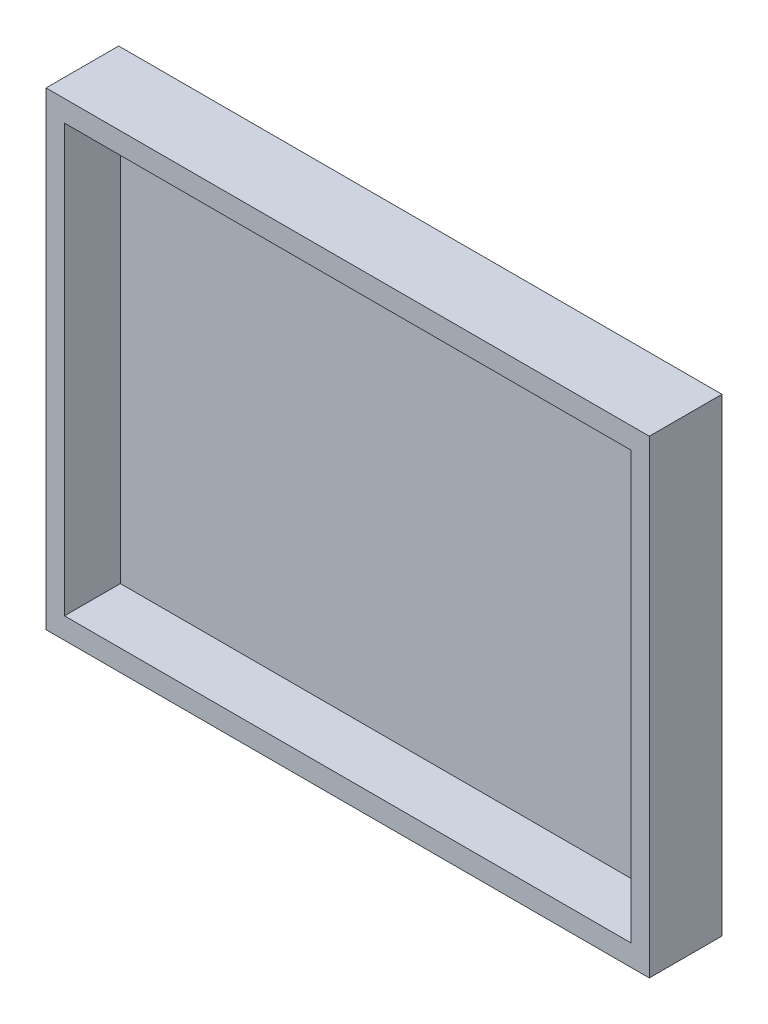
ISO-10303-21;
HEADER;
FILE_DESCRIPTION(('STEP AP214'),'2;1');
FILE_NAME('part.step','',(''),(''),'','','');
FILE_SCHEMA(('AUTOMOTIVE_DESIGN { 1 0 10303 214 1 1 1 1 }'));
ENDSEC;
DATA;
#1=APPLICATION_CONTEXT('core data for automotive mechanical design processes');
#2=APPLICATION_PROTOCOL_DEFINITION('international standard','automotive_design',2000,#1);
#3=PRODUCT_CONTEXT('',#1,'mechanical');
#4=PRODUCT('Part','Part','',(#3));
#5=PRODUCT_RELATED_PRODUCT_CATEGORY('part','',(#4));
#6=PRODUCT_DEFINITION_FORMATION('','',#4);
#7=PRODUCT_DEFINITION_CONTEXT('part definition',#1,'design');
#8=PRODUCT_DEFINITION('design','',#6,#7);
#9=PRODUCT_DEFINITION_SHAPE('','',#8);
#10=(LENGTH_UNIT() NAMED_UNIT(*) SI_UNIT(.MILLI.,.METRE.));
#11=(NAMED_UNIT(*) PLANE_ANGLE_UNIT() SI_UNIT($,.RADIAN.));
#12=(NAMED_UNIT(*) SI_UNIT($,.STERADIAN.) SOLID_ANGLE_UNIT());
#13=UNCERTAINTY_MEASURE_WITH_UNIT(LENGTH_MEASURE(1.E-05),#10,'distance_accuracy_value','');
#14=(GEOMETRIC_REPRESENTATION_CONTEXT(3) GLOBAL_UNCERTAINTY_ASSIGNED_CONTEXT((#13)) GLOBAL_UNIT_ASSIGNED_CONTEXT((#10,
#11,#12)) REPRESENTATION_CONTEXT('',''));
#15=CARTESIAN_POINT('',(0.,0.,0.));
#16=DIRECTION('',(0.,0.,1.));
#17=DIRECTION('',(1.,0.,0.));
#18=AXIS2_PLACEMENT_3D('',#15,#16,#17);
#19=CARTESIAN_POINT('',(0.,0.,0.));
#20=DIRECTION('',(0.,0.,1.));
#21=DIRECTION('',(1.,0.,0.));
#22=AXIS2_PLACEMENT_3D('',#19,#20,#21);
#23=PLANE('',#22);
#24=CARTESIAN_POINT('',(0.,0.,0.));
#25=DIRECTION('',(0.,0.,1.));
#26=DIRECTION('',(1.,0.,0.));
#27=AXIS2_PLACEMENT_3D('',#24,#25,#26);
#28=CIRCLE('',#27,7.5);
#29=CARTESIAN_POINT('',(7.5,0.,0.));
#30=VERTEX_POINT('',#29);
#31=EDGE_CURVE('E47',#30,#30,#28,.T.);
#32=ORIENTED_EDGE('',*,*,#31,.F.);
#33=EDGE_LOOP('',(#32));
#34=FACE_BOUND('',#33,.T.);
#35=CARTESIAN_POINT('',(0.,0.,0.));
#36=DIRECTION('',(0.,0.,1.));
#37=DIRECTION('',(1.,0.,0.));
#38=AXIS2_PLACEMENT_3D('',#35,#36,#37);
#39=CIRCLE('',#38,4.5);
#40=CARTESIAN_POINT('',(4.5,0.,0.));
#41=VERTEX_POINT('',#40);
#42=EDGE_CURVE('E208',#41,#41,#39,.T.);
#43=ORIENTED_EDGE('',*,*,#42,.T.);
#44=EDGE_LOOP('',(#43));
#45=FACE_BOUND('',#44,.T.);
#46=ADVANCED_FACE('F43',(#34,#45),#23,.F.);
#47=CARTESIAN_POINT('',(0.,0.,10.));
#48=DIRECTION('',(0.,0.,-1.));
#49=DIRECTION('',(-1.,0.,0.));
#50=AXIS2_PLACEMENT_3D('',#47,#48,#49);
#51=CYLINDRICAL_SURFACE('',#50,7.5);
#52=CARTESIAN_POINT('',(0.,0.,10.));
#53=DIRECTION('',(0.,0.,1.));
#54=DIRECTION('',(1.,0.,0.));
#55=AXIS2_PLACEMENT_3D('',#52,#53,#54);
#56=CIRCLE('',#55,7.5);
#57=CARTESIAN_POINT('',(7.5,0.,10.));
#58=VERTEX_POINT('',#57);
#59=EDGE_CURVE('E11',#58,#58,#56,.T.);
#60=ORIENTED_EDGE('',*,*,#59,.F.);
#61=EDGE_LOOP('',(#60));
#62=FACE_BOUND('',#61,.T.);
#63=ORIENTED_EDGE('',*,*,#31,.T.);
#64=EDGE_LOOP('',(#63));
#65=FACE_BOUND('',#64,.T.);
#66=ADVANCED_FACE('F45',(#62,#65),#51,.T.);
#67=CARTESIAN_POINT('',(0.,0.,10.));
#68=DIRECTION('',(0.,0.,-1.));
#69=DIRECTION('',(-1.,0.,0.));
#70=AXIS2_PLACEMENT_3D('',#67,#68,#69);
#71=CYLINDRICAL_SURFACE('',#70,4.5);
#72=CARTESIAN_POINT('',(0.,0.,10.));
#73=DIRECTION('',(0.,0.,1.));
#74=DIRECTION('',(1.,0.,0.));
#75=AXIS2_PLACEMENT_3D('',#72,#73,#74);
#76=CIRCLE('',#75,4.5);
#77=CARTESIAN_POINT('',(4.5,0.,10.));
#78=VERTEX_POINT('',#77);
#79=EDGE_CURVE('E204',#78,#78,#76,.T.);
#80=ORIENTED_EDGE('',*,*,#79,.T.);
#81=EDGE_LOOP('',(#80));
#82=FACE_BOUND('',#81,.T.);
#83=ORIENTED_EDGE('',*,*,#42,.F.);
#84=EDGE_LOOP('',(#83));
#85=FACE_BOUND('',#84,.T.);
#86=ADVANCED_FACE('F222',(#82,#85),#71,.F.);
#87=CARTESIAN_POINT('',(0.,0.,10.));
#88=DIRECTION('',(0.,0.,-1.));
#89=DIRECTION('',(-1.,0.,0.));
#90=AXIS2_PLACEMENT_3D('',#87,#88,#89);
#91=PLANE('',#90);
#92=ORIENTED_EDGE('',*,*,#79,.F.);
#93=EDGE_LOOP('',(#92));
#94=FACE_BOUND('',#93,.T.);
#95=ADVANCED_FACE('F227',(#94),#91,.T.);
#96=CARTESIAN_POINT('',(27.,-21.,16.5));
#97=DIRECTION('',(-1.,0.,0.));
#98=DIRECTION('',(0.,-1.,0.));
#99=AXIS2_PLACEMENT_3D('',#96,#97,#98);
#100=PLANE('',#99);
#101=DIRECTION('',(0.,1.,0.));
#102=VECTOR('',#101,1.);
#103=CARTESIAN_POINT('',(27.,-21.,10.));
#104=LINE('',#103,#102);
#105=CARTESIAN_POINT('',(27.,-21.,10.));
#106=VERTEX_POINT('',#105);
#107=CARTESIAN_POINT('',(27.,21.,10.));
#108=VERTEX_POINT('',#107);
#109=EDGE_CURVE('E164',#106,#108,#104,.T.);
#110=ORIENTED_EDGE('',*,*,#109,.T.);
#111=DIRECTION('',(0.,0.,-1.));
#112=VECTOR('',#111,1.);
#113=CARTESIAN_POINT('',(27.,21.,16.5));
#114=LINE('',#113,#112);
#115=CARTESIAN_POINT('',(27.,21.,16.5));
#116=VERTEX_POINT('',#115);
#117=EDGE_CURVE('E201',#116,#108,#114,.T.);
#118=ORIENTED_EDGE('',*,*,#117,.F.);
#119=DIRECTION('',(0.,1.,0.));
#120=VECTOR('',#119,1.);
#121=CARTESIAN_POINT('',(27.,-21.,16.5));
#122=LINE('',#121,#120);
#123=CARTESIAN_POINT('',(27.,-21.,16.5));
#124=VERTEX_POINT('',#123);
#125=EDGE_CURVE('E170',#124,#116,#122,.T.);
#126=ORIENTED_EDGE('',*,*,#125,.F.);
#127=DIRECTION('',(0.,0.,-1.));
#128=VECTOR('',#127,1.);
#129=CARTESIAN_POINT('',(27.,-21.,16.5));
#130=LINE('',#129,#128);
#131=EDGE_CURVE('E180',#124,#106,#130,.T.);
#132=ORIENTED_EDGE('',*,*,#131,.T.);
#133=EDGE_LOOP('',(#110,#118,#126,#132));
#134=FACE_BOUND('',#133,.T.);
#135=ADVANCED_FACE('F229',(#134),#100,.F.);
#136=CARTESIAN_POINT('',(-27.,21.,16.5));
#137=DIRECTION('',(0.,-1.,0.));
#138=DIRECTION('',(0.,0.,-1.));
#139=AXIS2_PLACEMENT_3D('',#136,#137,#138);
#140=PLANE('',#139);
#141=DIRECTION('',(-1.,0.,0.));
#142=VECTOR('',#141,1.);
#143=CARTESIAN_POINT('',(-27.,21.,10.));
#144=LINE('',#143,#142);
#145=CARTESIAN_POINT('',(-27.,21.,10.));
#146=VERTEX_POINT('',#145);
#147=EDGE_CURVE('E184',#108,#146,#144,.T.);
#148=ORIENTED_EDGE('',*,*,#147,.T.);
#149=DIRECTION('',(0.,0.,-1.));
#150=VECTOR('',#149,1.);
#151=CARTESIAN_POINT('',(-27.,21.,16.5));
#152=LINE('',#151,#150);
#153=CARTESIAN_POINT('',(-27.,21.,16.5));
#154=VERTEX_POINT('',#153);
#155=EDGE_CURVE('E197',#154,#146,#152,.T.);
#156=ORIENTED_EDGE('',*,*,#155,.F.);
#157=DIRECTION('',(-1.,0.,0.));
#158=VECTOR('',#157,1.);
#159=CARTESIAN_POINT('',(-27.,21.,16.5));
#160=LINE('',#159,#158);
#161=EDGE_CURVE('E97',#116,#154,#160,.T.);
#162=ORIENTED_EDGE('',*,*,#161,.F.);
#163=ORIENTED_EDGE('',*,*,#117,.T.);
#164=EDGE_LOOP('',(#148,#156,#162,#163));
#165=FACE_BOUND('',#164,.T.);
#166=ADVANCED_FACE('F232',(#165),#140,.F.);
#167=CARTESIAN_POINT('',(-27.,-21.,16.5));
#168=DIRECTION('',(1.,0.,0.));
#169=DIRECTION('',(0.,0.,-1.));
#170=AXIS2_PLACEMENT_3D('',#167,#168,#169);
#171=PLANE('',#170);
#172=DIRECTION('',(0.,-1.,0.));
#173=VECTOR('',#172,1.);
#174=CARTESIAN_POINT('',(-27.,-21.,10.));
#175=LINE('',#174,#173);
#176=CARTESIAN_POINT('',(-27.,-21.,10.));
#177=VERTEX_POINT('',#176);
#178=EDGE_CURVE('E187',#146,#177,#175,.T.);
#179=ORIENTED_EDGE('',*,*,#178,.T.);
#180=DIRECTION('',(0.,0.,-1.));
#181=VECTOR('',#180,1.);
#182=CARTESIAN_POINT('',(-27.,-21.,16.5));
#183=LINE('',#182,#181);
#184=CARTESIAN_POINT('',(-27.,-21.,16.5));
#185=VERTEX_POINT('',#184);
#186=EDGE_CURVE('E194',#185,#177,#183,.T.);
#187=ORIENTED_EDGE('',*,*,#186,.F.);
#188=DIRECTION('',(0.,-1.,0.));
#189=VECTOR('',#188,1.);
#190=CARTESIAN_POINT('',(-27.,-21.,16.5));
#191=LINE('',#190,#189);
#192=EDGE_CURVE('E175',#154,#185,#191,.T.);
#193=ORIENTED_EDGE('',*,*,#192,.F.);
#194=ORIENTED_EDGE('',*,*,#155,.T.);
#195=EDGE_LOOP('',(#179,#187,#193,#194));
#196=FACE_BOUND('',#195,.T.);
#197=ADVANCED_FACE('F236',(#196),#171,.F.);
#198=CARTESIAN_POINT('',(-27.,-21.,16.5));
#199=DIRECTION('',(0.,1.,0.));
#200=DIRECTION('',(0.,0.,1.));
#201=AXIS2_PLACEMENT_3D('',#198,#199,#200);
#202=PLANE('',#201);
#203=DIRECTION('',(1.,0.,0.));
#204=VECTOR('',#203,1.);
#205=CARTESIAN_POINT('',(-27.,-21.,10.));
#206=LINE('',#205,#204);
#207=EDGE_CURVE('E89',#177,#106,#206,.T.);
#208=ORIENTED_EDGE('',*,*,#207,.T.);
#209=ORIENTED_EDGE('',*,*,#131,.F.);
#210=DIRECTION('',(1.,0.,0.));
#211=VECTOR('',#210,1.);
#212=CARTESIAN_POINT('',(-27.,-21.,16.5));
#213=LINE('',#212,#211);
#214=EDGE_CURVE('E68',#185,#124,#213,.T.);
#215=ORIENTED_EDGE('',*,*,#214,.F.);
#216=ORIENTED_EDGE('',*,*,#186,.T.);
#217=EDGE_LOOP('',(#208,#209,#215,#216));
#218=FACE_BOUND('',#217,.T.);
#219=ADVANCED_FACE('F239',(#218),#202,.F.);
#220=CARTESIAN_POINT('',(0.,0.,16.5));
#221=DIRECTION('',(0.,0.,-1.));
#222=DIRECTION('',(-1.,0.,0.));
#223=AXIS2_PLACEMENT_3D('',#220,#221,#222);
#224=PLANE('',#223);
#225=DIRECTION('',(-1.,0.,0.));
#226=VECTOR('',#225,1.);
#227=CARTESIAN_POINT('',(-25.35,19.1,16.5));
#228=LINE('',#227,#226);
#229=CARTESIAN_POINT('',(25.35,19.1,16.5));
#230=VERTEX_POINT('',#229);
#231=CARTESIAN_POINT('',(-25.35,19.1,16.5));
#232=VERTEX_POINT('',#231);
#233=EDGE_CURVE('E155',#230,#232,#228,.T.);
#234=ORIENTED_EDGE('',*,*,#233,.F.);
#235=DIRECTION('',(0.,1.,0.));
#236=VECTOR('',#235,1.);
#237=CARTESIAN_POINT('',(25.35,-19.1,16.5));
#238=LINE('',#237,#236);
#239=CARTESIAN_POINT('',(25.35,-19.1,16.5));
#240=VERTEX_POINT('',#239);
#241=EDGE_CURVE('E59',#240,#230,#238,.T.);
#242=ORIENTED_EDGE('',*,*,#241,.F.);
#243=DIRECTION('',(1.,0.,0.));
#244=VECTOR('',#243,1.);
#245=CARTESIAN_POINT('',(-25.35,-19.1,16.5));
#246=LINE('',#245,#244);
#247=CARTESIAN_POINT('',(-25.35,-19.1,16.5));
#248=VERTEX_POINT('',#247);
#249=EDGE_CURVE('E142',#248,#240,#246,.T.);
#250=ORIENTED_EDGE('',*,*,#249,.F.);
#251=DIRECTION('',(0.,-1.,0.));
#252=VECTOR('',#251,1.);
#253=CARTESIAN_POINT('',(-25.35,-19.1,16.5));
#254=LINE('',#253,#252);
#255=EDGE_CURVE('E146',#232,#248,#254,.T.);
#256=ORIENTED_EDGE('',*,*,#255,.F.);
#257=EDGE_LOOP('',(#234,#242,#250,#256));
#258=FACE_BOUND('',#257,.T.);
#259=ORIENTED_EDGE('',*,*,#125,.T.);
#260=ORIENTED_EDGE('',*,*,#161,.T.);
#261=ORIENTED_EDGE('',*,*,#192,.T.);
#262=ORIENTED_EDGE('',*,*,#214,.T.);
#263=EDGE_LOOP('',(#259,#260,#261,#262));
#264=FACE_BOUND('',#263,.T.);
#265=ADVANCED_FACE('F243',(#258,#264),#224,.F.);
#266=ORIENTED_EDGE('',*,*,#59,.T.);
#267=EDGE_LOOP('',(#266));
#268=FACE_BOUND('',#267,.T.);
#269=ORIENTED_EDGE('',*,*,#109,.F.);
#270=ORIENTED_EDGE('',*,*,#207,.F.);
#271=ORIENTED_EDGE('',*,*,#178,.F.);
#272=ORIENTED_EDGE('',*,*,#147,.F.);
#273=EDGE_LOOP('',(#269,#270,#271,#272));
#274=FACE_BOUND('',#273,.T.);
#275=ADVANCED_FACE('F244',(#268,#274),#91,.T.);
#276=CARTESIAN_POINT('',(25.35,-19.1,11.5));
#277=DIRECTION('',(1.,0.,0.));
#278=DIRECTION('',(0.,0.,-1.));
#279=AXIS2_PLACEMENT_3D('',#276,#277,#278);
#280=PLANE('',#279);
#281=ORIENTED_EDGE('',*,*,#241,.T.);
#282=DIRECTION('',(0.,0.,1.));
#283=VECTOR('',#282,1.);
#284=CARTESIAN_POINT('',(25.35,19.1,11.5));
#285=LINE('',#284,#283);
#286=CARTESIAN_POINT('',(25.35,19.1,11.5));
#287=VERTEX_POINT('',#286);
#288=EDGE_CURVE('E117',#287,#230,#285,.T.);
#289=ORIENTED_EDGE('',*,*,#288,.F.);
#290=DIRECTION('',(0.,1.,0.));
#291=VECTOR('',#290,1.);
#292=CARTESIAN_POINT('',(25.35,-19.1,11.5));
#293=LINE('',#292,#291);
#294=CARTESIAN_POINT('',(25.35,-19.1,11.5));
#295=VERTEX_POINT('',#294);
#296=EDGE_CURVE('E121',#295,#287,#293,.T.);
#297=ORIENTED_EDGE('',*,*,#296,.F.);
#298=DIRECTION('',(0.,0.,1.));
#299=VECTOR('',#298,1.);
#300=CARTESIAN_POINT('',(25.35,-19.1,11.5));
#301=LINE('',#300,#299);
#302=EDGE_CURVE('E161',#295,#240,#301,.T.);
#303=ORIENTED_EDGE('',*,*,#302,.T.);
#304=EDGE_LOOP('',(#281,#289,#297,#303));
#305=FACE_BOUND('',#304,.T.);
#306=ADVANCED_FACE('F119',(#305),#280,.F.);
#307=CARTESIAN_POINT('',(-25.35,-19.1,11.5));
#308=DIRECTION('',(0.,-1.,0.));
#309=DIRECTION('',(0.,0.,-1.));
#310=AXIS2_PLACEMENT_3D('',#307,#308,#309);
#311=PLANE('',#310);
#312=ORIENTED_EDGE('',*,*,#249,.T.);
#313=ORIENTED_EDGE('',*,*,#302,.F.);
#314=DIRECTION('',(1.,0.,0.));
#315=VECTOR('',#314,1.);
#316=CARTESIAN_POINT('',(-25.35,-19.1,11.5));
#317=LINE('',#316,#315);
#318=CARTESIAN_POINT('',(-25.35,-19.1,11.5));
#319=VERTEX_POINT('',#318);
#320=EDGE_CURVE('E128',#319,#295,#317,.T.);
#321=ORIENTED_EDGE('',*,*,#320,.F.);
#322=DIRECTION('',(0.,0.,1.));
#323=VECTOR('',#322,1.);
#324=CARTESIAN_POINT('',(-25.35,-19.1,11.5));
#325=LINE('',#324,#323);
#326=EDGE_CURVE('E165',#319,#248,#325,.T.);
#327=ORIENTED_EDGE('',*,*,#326,.T.);
#328=EDGE_LOOP('',(#312,#313,#321,#327));
#329=FACE_BOUND('',#328,.T.);
#330=ADVANCED_FACE('F253',(#329),#311,.F.);
#331=CARTESIAN_POINT('',(-25.35,-19.1,11.5));
#332=DIRECTION('',(-1.,0.,0.));
#333=DIRECTION('',(0.,0.,1.));
#334=AXIS2_PLACEMENT_3D('',#331,#332,#333);
#335=PLANE('',#334);
#336=ORIENTED_EDGE('',*,*,#255,.T.);
#337=ORIENTED_EDGE('',*,*,#326,.F.);
#338=DIRECTION('',(0.,-1.,0.));
#339=VECTOR('',#338,1.);
#340=CARTESIAN_POINT('',(-25.35,-19.1,11.5));
#341=LINE('',#340,#339);
#342=CARTESIAN_POINT('',(-25.35,19.1,11.5));
#343=VERTEX_POINT('',#342);
#344=EDGE_CURVE('E137',#343,#319,#341,.T.);
#345=ORIENTED_EDGE('',*,*,#344,.F.);
#346=DIRECTION('',(0.,0.,1.));
#347=VECTOR('',#346,1.);
#348=CARTESIAN_POINT('',(-25.35,19.1,11.5));
#349=LINE('',#348,#347);
#350=EDGE_CURVE('E127',#343,#232,#349,.T.);
#351=ORIENTED_EDGE('',*,*,#350,.T.);
#352=EDGE_LOOP('',(#336,#337,#345,#351));
#353=FACE_BOUND('',#352,.T.);
#354=ADVANCED_FACE('F256',(#353),#335,.F.);
#355=CARTESIAN_POINT('',(-25.35,19.1,11.5));
#356=DIRECTION('',(0.,1.,0.));
#357=DIRECTION('',(0.,0.,1.));
#358=AXIS2_PLACEMENT_3D('',#355,#356,#357);
#359=PLANE('',#358);
#360=ORIENTED_EDGE('',*,*,#233,.T.);
#361=ORIENTED_EDGE('',*,*,#350,.F.);
#362=DIRECTION('',(-1.,0.,0.));
#363=VECTOR('',#362,1.);
#364=CARTESIAN_POINT('',(-25.35,19.1,11.5));
#365=LINE('',#364,#363);
#366=EDGE_CURVE('E131',#287,#343,#365,.T.);
#367=ORIENTED_EDGE('',*,*,#366,.F.);
#368=ORIENTED_EDGE('',*,*,#288,.T.);
#369=EDGE_LOOP('',(#360,#361,#367,#368));
#370=FACE_BOUND('',#369,.T.);
#371=ADVANCED_FACE('F132',(#370),#359,.F.);
#372=CARTESIAN_POINT('',(0.,0.,11.5));
#373=DIRECTION('',(0.,0.,-1.));
#374=DIRECTION('',(-1.,0.,0.));
#375=AXIS2_PLACEMENT_3D('',#372,#373,#374);
#376=PLANE('',#375);
#377=ORIENTED_EDGE('',*,*,#296,.T.);
#378=ORIENTED_EDGE('',*,*,#366,.T.);
#379=ORIENTED_EDGE('',*,*,#344,.T.);
#380=ORIENTED_EDGE('',*,*,#320,.T.);
#381=EDGE_LOOP('',(#377,#378,#379,#380));
#382=FACE_BOUND('',#381,.T.);
#383=ADVANCED_FACE('F139',(#382),#376,.F.);
#384=CLOSED_SHELL('',(#46,#66,#86,#95,#135,#166,#197,#219,#265,#275,#306,#330,#354,#371,#383));
#385=MANIFOLD_SOLID_BREP('B2',#384);
#386=ADVANCED_BREP_SHAPE_REPRESENTATION('',(#18,#385),#14);
#387=SHAPE_DEFINITION_REPRESENTATION(#9,#386);
ENDSEC;
END-ISO-10303-21;
